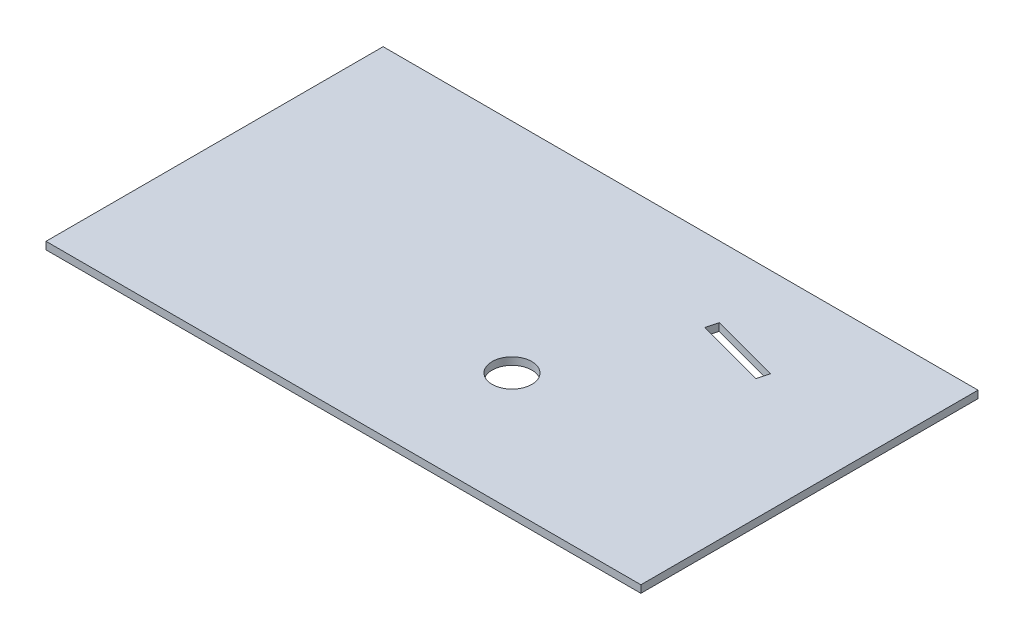
ISO-10303-21;
HEADER;
FILE_DESCRIPTION(('STEP AP214'),'2;1');
FILE_NAME('part.step','',(''),(''),'','','');
FILE_SCHEMA(('AUTOMOTIVE_DESIGN { 1 0 10303 214 1 1 1 1 }'));
ENDSEC;
DATA;
#1=APPLICATION_CONTEXT('core data for automotive mechanical design processes');
#2=APPLICATION_PROTOCOL_DEFINITION('international standard','automotive_design',2000,#1);
#3=PRODUCT_CONTEXT('',#1,'mechanical');
#4=PRODUCT('Part','Part','',(#3));
#5=PRODUCT_RELATED_PRODUCT_CATEGORY('part','',(#4));
#6=PRODUCT_DEFINITION_FORMATION('','',#4);
#7=PRODUCT_DEFINITION_CONTEXT('part definition',#1,'design');
#8=PRODUCT_DEFINITION('design','',#6,#7);
#9=PRODUCT_DEFINITION_SHAPE('','',#8);
#10=(LENGTH_UNIT() NAMED_UNIT(*) SI_UNIT(.MILLI.,.METRE.));
#11=(NAMED_UNIT(*) PLANE_ANGLE_UNIT() SI_UNIT($,.RADIAN.));
#12=(NAMED_UNIT(*) SI_UNIT($,.STERADIAN.) SOLID_ANGLE_UNIT());
#13=UNCERTAINTY_MEASURE_WITH_UNIT(LENGTH_MEASURE(1.E-05),#10,'distance_accuracy_value','');
#14=(GEOMETRIC_REPRESENTATION_CONTEXT(3) GLOBAL_UNCERTAINTY_ASSIGNED_CONTEXT((#13)) GLOBAL_UNIT_ASSIGNED_CONTEXT((#10,
#11,#12)) REPRESENTATION_CONTEXT('',''));
#15=CARTESIAN_POINT('',(0.,0.,0.));
#16=DIRECTION('',(0.,0.,1.));
#17=DIRECTION('',(1.,0.,0.));
#18=AXIS2_PLACEMENT_3D('',#15,#16,#17);
#19=CARTESIAN_POINT('',(0.,50.8,0.));
#20=DIRECTION('',(0.,1.,0.));
#21=DIRECTION('',(0.,0.,1.));
#22=AXIS2_PLACEMENT_3D('',#19,#20,#21);
#23=PLANE('',#22);
#24=DIRECTION('',(0.965925826289068,0.,0.258819045102521));
#25=VECTOR('',#24,1.);
#26=CARTESIAN_POINT('',(154.068293489598,50.8,-376.859298132638));
#27=LINE('',#26,#25);
#28=CARTESIAN_POINT('',(154.068293489598,50.8,-376.859298132638));
#29=VERTEX_POINT('',#28);
#30=CARTESIAN_POINT('',(332.764571353076,50.8,-328.977774788672));
#31=VERTEX_POINT('',#30);
#32=EDGE_CURVE('E181',#29,#31,#27,.T.);
#33=ORIENTED_EDGE('',*,*,#32,.F.);
#34=DIRECTION('',(0.258819045102523,0.,-0.965925826289067));
#35=VECTOR('',#34,1.);
#36=CARTESIAN_POINT('',(146.303722136522,50.8,-347.881523343966));
#37=LINE('',#36,#35);
#38=CARTESIAN_POINT('',(146.303722136522,50.8,-347.881523343966));
#39=VERTEX_POINT('',#38);
#40=EDGE_CURVE('E61',#39,#29,#37,.T.);
#41=ORIENTED_EDGE('',*,*,#40,.F.);
#42=DIRECTION('',(-0.965925826289068,0.,-0.258819045102522));
#43=VECTOR('',#42,1.);
#44=CARTESIAN_POINT('',(325.,50.8,-300.));
#45=LINE('',#44,#43);
#46=CARTESIAN_POINT('',(325.,50.8,-300.));
#47=VERTEX_POINT('',#46);
#48=EDGE_CURVE('E168',#47,#39,#45,.T.);
#49=ORIENTED_EDGE('',*,*,#48,.F.);
#50=DIRECTION('',(-0.258819045102525,0.,0.965925826289067));
#51=VECTOR('',#50,1.);
#52=CARTESIAN_POINT('',(332.764571353076,50.8,-328.977774788672));
#53=LINE('',#52,#51);
#54=EDGE_CURVE('E172',#31,#47,#53,.T.);
#55=ORIENTED_EDGE('',*,*,#54,.F.);
#56=EDGE_LOOP('',(#33,#41,#49,#55));
#57=FACE_BOUND('',#56,.T.);
#58=DIRECTION('',(0.,0.,1.));
#59=VECTOR('',#58,1.);
#60=CARTESIAN_POINT('',(-889.,50.8,-558.8));
#61=LINE('',#60,#59);
#62=CARTESIAN_POINT('',(-889.,50.8,-558.8));
#63=VERTEX_POINT('',#62);
#64=CARTESIAN_POINT('',(-889.,50.8,304.8));
#65=VERTEX_POINT('',#64);
#66=EDGE_CURVE('E230',#63,#65,#61,.T.);
#67=ORIENTED_EDGE('',*,*,#66,.F.);
#68=DIRECTION('',(-1.,0.,0.));
#69=VECTOR('',#68,1.);
#70=CARTESIAN_POINT('',(-889.,50.8,-558.8));
#71=LINE('',#70,#69);
#72=CARTESIAN_POINT('',(635.,50.8,-558.8));
#73=VERTEX_POINT('',#72);
#74=EDGE_CURVE('E236',#73,#63,#71,.T.);
#75=ORIENTED_EDGE('',*,*,#74,.F.);
#76=DIRECTION('',(0.,0.,-1.));
#77=VECTOR('',#76,1.);
#78=CARTESIAN_POINT('',(635.,50.8,-558.8));
#79=LINE('',#78,#77);
#80=CARTESIAN_POINT('',(635.,50.8,304.8));
#81=VERTEX_POINT('',#80);
#82=EDGE_CURVE('E252',#81,#73,#79,.T.);
#83=ORIENTED_EDGE('',*,*,#82,.F.);
#84=DIRECTION('',(1.,0.,0.));
#85=VECTOR('',#84,1.);
#86=CARTESIAN_POINT('',(-889.,50.8,304.8));
#87=LINE('',#86,#85);
#88=EDGE_CURVE('E249',#65,#81,#87,.T.);
#89=ORIENTED_EDGE('',*,*,#88,.F.);
#90=EDGE_LOOP('',(#67,#75,#83,#89));
#91=FACE_BOUND('',#90,.T.);
#92=CARTESIAN_POINT('',(0.,50.8,0.));
#93=DIRECTION('',(0.,-1.,0.));
#94=DIRECTION('',(0.,0.,-1.));
#95=AXIS2_PLACEMENT_3D('',#92,#93,#94);
#96=CIRCLE('',#95,50.8);
#97=CARTESIAN_POINT('',(0.,50.8,-50.8));
#98=VERTEX_POINT('',#97);
#99=EDGE_CURVE('E222',#98,#98,#96,.T.);
#100=ORIENTED_EDGE('',*,*,#99,.F.);
#101=EDGE_LOOP('',(#100));
#102=FACE_BOUND('',#101,.T.);
#103=DIRECTION('',(0.,0.,-1.));
#104=VECTOR('',#103,1.);
#105=CARTESIAN_POINT('',(-525.5875,50.8,204.));
#106=LINE('',#105,#104);
#107=CARTESIAN_POINT('',(-525.5875,50.8,204.));
#108=VERTEX_POINT('',#107);
#109=CARTESIAN_POINT('',(-525.5875,50.8,0.));
#110=VERTEX_POINT('',#109);
#111=EDGE_CURVE('E209',#108,#110,#106,.T.);
#112=ORIENTED_EDGE('',*,*,#111,.F.);
#113=DIRECTION('',(-1.,0.,0.));
#114=VECTOR('',#113,1.);
#115=CARTESIAN_POINT('',(-525.5875,50.8,204.));
#116=LINE('',#115,#114);
#117=CARTESIAN_POINT('',(-524.,50.8,204.));
#118=VERTEX_POINT('',#117);
#119=EDGE_CURVE('E206',#118,#108,#116,.T.);
#120=ORIENTED_EDGE('',*,*,#119,.F.);
#121=DIRECTION('',(0.,0.,-1.));
#122=VECTOR('',#121,1.);
#123=CARTESIAN_POINT('',(-524.,50.8,204.));
#124=LINE('',#123,#122);
#125=CARTESIAN_POINT('',(-524.,50.8,0.));
#126=VERTEX_POINT('',#125);
#127=EDGE_CURVE('E212',#118,#126,#124,.T.);
#128=ORIENTED_EDGE('',*,*,#127,.T.);
#129=CARTESIAN_POINT('',(0.,50.8,0.));
#130=DIRECTION('',(0.,-1.,0.));
#131=DIRECTION('',(0.,0.,1.));
#132=AXIS2_PLACEMENT_3D('',#129,#130,#131);
#133=CIRCLE('',#132,524.);
#134=CARTESIAN_POINT('',(277.677694458201,50.8,-444.377202385966));
#135=VERTEX_POINT('',#134);
#136=EDGE_CURVE('E273',#126,#135,#133,.T.);
#137=ORIENTED_EDGE('',*,*,#136,.T.);
#138=DIRECTION('',(0.,0.,-1.));
#139=VECTOR('',#138,1.);
#140=CARTESIAN_POINT('',(277.677694458201,50.8,-444.377202385966));
#141=LINE('',#140,#139);
#142=CARTESIAN_POINT('',(277.677694458201,50.8,-446.248045549365));
#143=VERTEX_POINT('',#142);
#144=EDGE_CURVE('E277',#135,#143,#141,.T.);
#145=ORIENTED_EDGE('',*,*,#144,.T.);
#146=CARTESIAN_POINT('',(0.,50.8,0.));
#147=DIRECTION('',(0.,1.,0.));
#148=DIRECTION('',(0.,0.,1.));
#149=AXIS2_PLACEMENT_3D('',#146,#147,#148);
#150=CIRCLE('',#149,525.5875);
#151=EDGE_CURVE('E282',#143,#110,#150,.T.);
#152=ORIENTED_EDGE('',*,*,#151,.T.);
#153=EDGE_LOOP('',(#112,#120,#128,#137,#145,#152));
#154=FACE_BOUND('',#153,.T.);
#155=ADVANCED_FACE('F45',(#57,#91,#102,#154),#23,.F.);
#156=CARTESIAN_POINT('',(0.,50.8,0.));
#157=DIRECTION('',(0.,-1.,0.));
#158=DIRECTION('',(0.,0.,-1.));
#159=AXIS2_PLACEMENT_3D('',#156,#157,#158);
#160=CYLINDRICAL_SURFACE('',#159,524.);
#161=CARTESIAN_POINT('',(0.,0.,0.));
#162=DIRECTION('',(0.,-1.,0.));
#163=DIRECTION('',(0.,0.,1.));
#164=AXIS2_PLACEMENT_3D('',#161,#162,#163);
#165=CIRCLE('',#164,524.);
#166=CARTESIAN_POINT('',(-524.,0.,0.));
#167=VERTEX_POINT('',#166);
#168=CARTESIAN_POINT('',(277.677694458201,0.,-444.377202385966));
#169=VERTEX_POINT('',#168);
#170=EDGE_CURVE('E272',#167,#169,#165,.T.);
#171=ORIENTED_EDGE('',*,*,#170,.T.);
#172=DIRECTION('',(0.,-1.,0.));
#173=VECTOR('',#172,1.);
#174=CARTESIAN_POINT('',(277.677694458201,50.8,-444.377202385966));
#175=LINE('',#174,#173);
#176=EDGE_CURVE('E11',#135,#169,#175,.T.);
#177=ORIENTED_EDGE('',*,*,#176,.F.);
#178=ORIENTED_EDGE('',*,*,#136,.F.);
#179=DIRECTION('',(0.,-1.,0.));
#180=VECTOR('',#179,1.);
#181=CARTESIAN_POINT('',(-524.,50.8,0.));
#182=LINE('',#181,#180);
#183=EDGE_CURVE('E286',#126,#167,#182,.T.);
#184=ORIENTED_EDGE('',*,*,#183,.T.);
#185=EDGE_LOOP('',(#171,#177,#178,#184));
#186=FACE_BOUND('',#185,.T.);
#187=ADVANCED_FACE('F47',(#186),#160,.F.);
#188=CARTESIAN_POINT('',(277.677694458201,50.8,-444.377202385966));
#189=DIRECTION('',(-1.,0.,0.));
#190=DIRECTION('',(0.,0.,1.));
#191=AXIS2_PLACEMENT_3D('',#188,#189,#190);
#192=PLANE('',#191);
#193=DIRECTION('',(0.,0.,-1.));
#194=VECTOR('',#193,1.);
#195=CARTESIAN_POINT('',(277.677694458201,0.,-444.377202385966));
#196=LINE('',#195,#194);
#197=CARTESIAN_POINT('',(277.677694458201,0.,-446.248045549365));
#198=VERTEX_POINT('',#197);
#199=EDGE_CURVE('E290',#169,#198,#196,.T.);
#200=ORIENTED_EDGE('',*,*,#199,.T.);
#201=DIRECTION('',(0.,-1.,0.));
#202=VECTOR('',#201,1.);
#203=CARTESIAN_POINT('',(277.677694458201,50.8,-446.248045549365));
#204=LINE('',#203,#202);
#205=EDGE_CURVE('E54',#143,#198,#204,.T.);
#206=ORIENTED_EDGE('',*,*,#205,.F.);
#207=ORIENTED_EDGE('',*,*,#144,.F.);
#208=ORIENTED_EDGE('',*,*,#176,.T.);
#209=EDGE_LOOP('',(#200,#206,#207,#208));
#210=FACE_BOUND('',#209,.T.);
#211=ADVANCED_FACE('F323',(#210),#192,.F.);
#212=CARTESIAN_POINT('',(0.,50.8,0.));
#213=DIRECTION('',(0.,-1.,0.));
#214=DIRECTION('',(0.,0.,-1.));
#215=AXIS2_PLACEMENT_3D('',#212,#213,#214);
#216=CYLINDRICAL_SURFACE('',#215,525.5875);
#217=CARTESIAN_POINT('',(0.,0.,0.));
#218=DIRECTION('',(0.,1.,0.));
#219=DIRECTION('',(0.,0.,1.));
#220=AXIS2_PLACEMENT_3D('',#217,#218,#219);
#221=CIRCLE('',#220,525.5875);
#222=CARTESIAN_POINT('',(-525.5875,0.,0.));
#223=VERTEX_POINT('',#222);
#224=EDGE_CURVE('E278',#198,#223,#221,.T.);
#225=ORIENTED_EDGE('',*,*,#224,.T.);
#226=DIRECTION('',(0.,-1.,0.));
#227=VECTOR('',#226,1.);
#228=CARTESIAN_POINT('',(-525.5875,50.8,0.));
#229=LINE('',#228,#227);
#230=EDGE_CURVE('E299',#110,#223,#229,.T.);
#231=ORIENTED_EDGE('',*,*,#230,.F.);
#232=ORIENTED_EDGE('',*,*,#151,.F.);
#233=ORIENTED_EDGE('',*,*,#205,.T.);
#234=EDGE_LOOP('',(#225,#231,#232,#233));
#235=FACE_BOUND('',#234,.T.);
#236=ADVANCED_FACE('F307',(#235),#216,.T.);
#237=CARTESIAN_POINT('',(0.,0.,0.));
#238=DIRECTION('',(0.,1.,0.));
#239=DIRECTION('',(0.,0.,1.));
#240=AXIS2_PLACEMENT_3D('',#237,#238,#239);
#241=PLANE('',#240);
#242=ORIENTED_EDGE('',*,*,#170,.F.);
#243=DIRECTION('',(0.,0.,-1.));
#244=VECTOR('',#243,1.);
#245=CARTESIAN_POINT('',(-524.,0.,204.));
#246=LINE('',#245,#244);
#247=CARTESIAN_POINT('',(-524.,0.,204.));
#248=VERTEX_POINT('',#247);
#249=EDGE_CURVE('E216',#248,#167,#246,.T.);
#250=ORIENTED_EDGE('',*,*,#249,.F.);
#251=DIRECTION('',(1.,0.,0.));
#252=VECTOR('',#251,1.);
#253=CARTESIAN_POINT('',(-525.5875,0.,204.));
#254=LINE('',#253,#252);
#255=CARTESIAN_POINT('',(-525.5875,0.,204.));
#256=VERTEX_POINT('',#255);
#257=EDGE_CURVE('E199',#256,#248,#254,.T.);
#258=ORIENTED_EDGE('',*,*,#257,.F.);
#259=DIRECTION('',(0.,0.,-1.));
#260=VECTOR('',#259,1.);
#261=CARTESIAN_POINT('',(-525.5875,0.,204.));
#262=LINE('',#261,#260);
#263=EDGE_CURVE('E219',#256,#223,#262,.T.);
#264=ORIENTED_EDGE('',*,*,#263,.T.);
#265=ORIENTED_EDGE('',*,*,#224,.F.);
#266=ORIENTED_EDGE('',*,*,#199,.F.);
#267=EDGE_LOOP('',(#242,#250,#258,#264,#265,#266));
#268=FACE_BOUND('',#267,.T.);
#269=ADVANCED_FACE('F312',(#268),#241,.F.);
#270=CARTESIAN_POINT('',(-889.,69.85,-558.8));
#271=DIRECTION('',(1.,0.,0.));
#272=DIRECTION('',(0.,0.,-1.));
#273=AXIS2_PLACEMENT_3D('',#270,#271,#272);
#274=PLANE('',#273);
#275=ORIENTED_EDGE('',*,*,#66,.T.);
#276=DIRECTION('',(0.,-1.,0.));
#277=VECTOR('',#276,1.);
#278=CARTESIAN_POINT('',(-889.,69.85,304.8));
#279=LINE('',#278,#277);
#280=CARTESIAN_POINT('',(-889.,69.85,304.8));
#281=VERTEX_POINT('',#280);
#282=EDGE_CURVE('E268',#281,#65,#279,.T.);
#283=ORIENTED_EDGE('',*,*,#282,.F.);
#284=DIRECTION('',(0.,0.,1.));
#285=VECTOR('',#284,1.);
#286=CARTESIAN_POINT('',(-889.,69.85,-558.8));
#287=LINE('',#286,#285);
#288=CARTESIAN_POINT('',(-889.,69.85,-558.8));
#289=VERTEX_POINT('',#288);
#290=EDGE_CURVE('E231',#289,#281,#287,.T.);
#291=ORIENTED_EDGE('',*,*,#290,.F.);
#292=DIRECTION('',(0.,-1.,0.));
#293=VECTOR('',#292,1.);
#294=CARTESIAN_POINT('',(-889.,69.85,-558.8));
#295=LINE('',#294,#293);
#296=EDGE_CURVE('E245',#289,#63,#295,.T.);
#297=ORIENTED_EDGE('',*,*,#296,.T.);
#298=EDGE_LOOP('',(#275,#283,#291,#297));
#299=FACE_BOUND('',#298,.T.);
#300=ADVANCED_FACE('F361',(#299),#274,.F.);
#301=CARTESIAN_POINT('',(-889.,69.85,304.8));
#302=DIRECTION('',(0.,0.,-1.));
#303=DIRECTION('',(-1.,0.,0.));
#304=AXIS2_PLACEMENT_3D('',#301,#302,#303);
#305=PLANE('',#304);
#306=ORIENTED_EDGE('',*,*,#88,.T.);
#307=DIRECTION('',(0.,-1.,0.));
#308=VECTOR('',#307,1.);
#309=CARTESIAN_POINT('',(635.,69.85,304.8));
#310=LINE('',#309,#308);
#311=CARTESIAN_POINT('',(635.,69.85,304.8));
#312=VERTEX_POINT('',#311);
#313=EDGE_CURVE('E264',#312,#81,#310,.T.);
#314=ORIENTED_EDGE('',*,*,#313,.F.);
#315=DIRECTION('',(1.,0.,0.));
#316=VECTOR('',#315,1.);
#317=CARTESIAN_POINT('',(-889.,69.85,304.8));
#318=LINE('',#317,#316);
#319=EDGE_CURVE('E235',#281,#312,#318,.T.);
#320=ORIENTED_EDGE('',*,*,#319,.F.);
#321=ORIENTED_EDGE('',*,*,#282,.T.);
#322=EDGE_LOOP('',(#306,#314,#320,#321));
#323=FACE_BOUND('',#322,.T.);
#324=ADVANCED_FACE('F357',(#323),#305,.F.);
#325=CARTESIAN_POINT('',(635.,69.85,-558.8));
#326=DIRECTION('',(-1.,0.,0.));
#327=DIRECTION('',(0.,0.,1.));
#328=AXIS2_PLACEMENT_3D('',#325,#326,#327);
#329=PLANE('',#328);
#330=ORIENTED_EDGE('',*,*,#82,.T.);
#331=DIRECTION('',(0.,-1.,0.));
#332=VECTOR('',#331,1.);
#333=CARTESIAN_POINT('',(635.,69.85,-558.8));
#334=LINE('',#333,#332);
#335=CARTESIAN_POINT('',(635.,69.85,-558.8));
#336=VERTEX_POINT('',#335);
#337=EDGE_CURVE('E260',#336,#73,#334,.T.);
#338=ORIENTED_EDGE('',*,*,#337,.F.);
#339=DIRECTION('',(0.,0.,-1.));
#340=VECTOR('',#339,1.);
#341=CARTESIAN_POINT('',(635.,69.85,-558.8));
#342=LINE('',#341,#340);
#343=EDGE_CURVE('E239',#312,#336,#342,.T.);
#344=ORIENTED_EDGE('',*,*,#343,.F.);
#345=ORIENTED_EDGE('',*,*,#313,.T.);
#346=EDGE_LOOP('',(#330,#338,#344,#345));
#347=FACE_BOUND('',#346,.T.);
#348=ADVANCED_FACE('F353',(#347),#329,.F.);
#349=CARTESIAN_POINT('',(-889.,69.85,-558.8));
#350=DIRECTION('',(0.,0.,1.));
#351=DIRECTION('',(1.,0.,0.));
#352=AXIS2_PLACEMENT_3D('',#349,#350,#351);
#353=PLANE('',#352);
#354=ORIENTED_EDGE('',*,*,#74,.T.);
#355=ORIENTED_EDGE('',*,*,#296,.F.);
#356=DIRECTION('',(-1.,0.,0.));
#357=VECTOR('',#356,1.);
#358=CARTESIAN_POINT('',(-889.,69.85,-558.8));
#359=LINE('',#358,#357);
#360=EDGE_CURVE('E242',#336,#289,#359,.T.);
#361=ORIENTED_EDGE('',*,*,#360,.F.);
#362=ORIENTED_EDGE('',*,*,#337,.T.);
#363=EDGE_LOOP('',(#354,#355,#361,#362));
#364=FACE_BOUND('',#363,.T.);
#365=ADVANCED_FACE('F350',(#364),#353,.F.);
#366=CARTESIAN_POINT('',(0.,69.85,0.));
#367=DIRECTION('',(0.,1.,0.));
#368=DIRECTION('',(0.,0.,1.));
#369=AXIS2_PLACEMENT_3D('',#366,#367,#368);
#370=PLANE('',#369);
#371=DIRECTION('',(0.258819045102523,0.,-0.965925826289067));
#372=VECTOR('',#371,1.);
#373=CARTESIAN_POINT('',(146.303722136522,69.85,-347.881523343966));
#374=LINE('',#373,#372);
#375=CARTESIAN_POINT('',(146.303722136522,69.85,-347.881523343966));
#376=VERTEX_POINT('',#375);
#377=CARTESIAN_POINT('',(154.068293489598,69.85,-376.859298132638));
#378=VERTEX_POINT('',#377);
#379=EDGE_CURVE('E149',#376,#378,#374,.T.);
#380=ORIENTED_EDGE('',*,*,#379,.T.);
#381=DIRECTION('',(0.965925826289068,0.,0.258819045102521));
#382=VECTOR('',#381,1.);
#383=CARTESIAN_POINT('',(154.068293489598,69.85,-376.859298132638));
#384=LINE('',#383,#382);
#385=CARTESIAN_POINT('',(332.764571353076,69.85,-328.977774788672));
#386=VERTEX_POINT('',#385);
#387=EDGE_CURVE('E159',#378,#386,#384,.T.);
#388=ORIENTED_EDGE('',*,*,#387,.T.);
#389=DIRECTION('',(-0.258819045102525,0.,0.965925826289067));
#390=VECTOR('',#389,1.);
#391=CARTESIAN_POINT('',(332.764571353076,69.85,-328.977774788672));
#392=LINE('',#391,#390);
#393=CARTESIAN_POINT('',(325.,69.85,-300.));
#394=VERTEX_POINT('',#393);
#395=EDGE_CURVE('E69',#386,#394,#392,.T.);
#396=ORIENTED_EDGE('',*,*,#395,.T.);
#397=DIRECTION('',(-0.965925826289068,0.,-0.258819045102522));
#398=VECTOR('',#397,1.);
#399=CARTESIAN_POINT('',(325.,69.85,-300.));
#400=LINE('',#399,#398);
#401=EDGE_CURVE('E156',#394,#376,#400,.T.);
#402=ORIENTED_EDGE('',*,*,#401,.T.);
#403=EDGE_LOOP('',(#380,#388,#396,#402));
#404=FACE_BOUND('',#403,.T.);
#405=CARTESIAN_POINT('',(0.,69.85,0.));
#406=DIRECTION('',(0.,-1.,0.));
#407=DIRECTION('',(0.,0.,-1.));
#408=AXIS2_PLACEMENT_3D('',#405,#406,#407);
#409=CIRCLE('',#408,50.8);
#410=CARTESIAN_POINT('',(0.,69.85,-50.8));
#411=VERTEX_POINT('',#410);
#412=EDGE_CURVE('E226',#411,#411,#409,.T.);
#413=ORIENTED_EDGE('',*,*,#412,.T.);
#414=EDGE_LOOP('',(#413));
#415=FACE_BOUND('',#414,.T.);
#416=ORIENTED_EDGE('',*,*,#290,.T.);
#417=ORIENTED_EDGE('',*,*,#319,.T.);
#418=ORIENTED_EDGE('',*,*,#343,.T.);
#419=ORIENTED_EDGE('',*,*,#360,.T.);
#420=EDGE_LOOP('',(#416,#417,#418,#419));
#421=FACE_BOUND('',#420,.T.);
#422=ADVANCED_FACE('F164',(#404,#415,#421),#370,.T.);
#423=CARTESIAN_POINT('',(0.,50.8,0.));
#424=DIRECTION('',(0.,-1.,0.));
#425=DIRECTION('',(0.,0.,-1.));
#426=AXIS2_PLACEMENT_3D('',#423,#424,#425);
#427=CYLINDRICAL_SURFACE('',#426,50.8);
#428=ORIENTED_EDGE('',*,*,#412,.F.);
#429=EDGE_LOOP('',(#428));
#430=FACE_BOUND('',#429,.T.);
#431=ORIENTED_EDGE('',*,*,#99,.T.);
#432=EDGE_LOOP('',(#431));
#433=FACE_BOUND('',#432,.T.);
#434=ADVANCED_FACE('F400',(#430,#433),#427,.F.);
#435=CARTESIAN_POINT('',(-525.5875,50.8,204.));
#436=DIRECTION('',(1.,0.,0.));
#437=DIRECTION('',(0.,0.,-1.));
#438=AXIS2_PLACEMENT_3D('',#435,#436,#437);
#439=PLANE('',#438);
#440=ORIENTED_EDGE('',*,*,#230,.T.);
#441=ORIENTED_EDGE('',*,*,#263,.F.);
#442=DIRECTION('',(0.,-1.,0.));
#443=VECTOR('',#442,1.);
#444=CARTESIAN_POINT('',(-525.5875,50.8,204.));
#445=LINE('',#444,#443);
#446=EDGE_CURVE('E190',#108,#256,#445,.T.);
#447=ORIENTED_EDGE('',*,*,#446,.F.);
#448=ORIENTED_EDGE('',*,*,#111,.T.);
#449=EDGE_LOOP('',(#440,#441,#447,#448));
#450=FACE_BOUND('',#449,.T.);
#451=ADVANCED_FACE('F317',(#450),#439,.F.);
#452=CARTESIAN_POINT('',(-524.,50.8,204.));
#453=DIRECTION('',(-1.,0.,0.));
#454=DIRECTION('',(0.,0.,1.));
#455=AXIS2_PLACEMENT_3D('',#452,#453,#454);
#456=PLANE('',#455);
#457=ORIENTED_EDGE('',*,*,#183,.F.);
#458=ORIENTED_EDGE('',*,*,#127,.F.);
#459=DIRECTION('',(0.,1.,0.));
#460=VECTOR('',#459,1.);
#461=CARTESIAN_POINT('',(-524.,50.8,204.));
#462=LINE('',#461,#460);
#463=EDGE_CURVE('E202',#248,#118,#462,.T.);
#464=ORIENTED_EDGE('',*,*,#463,.F.);
#465=ORIENTED_EDGE('',*,*,#249,.T.);
#466=EDGE_LOOP('',(#457,#458,#464,#465));
#467=FACE_BOUND('',#466,.T.);
#468=ADVANCED_FACE('F327',(#467),#456,.F.);
#469=CARTESIAN_POINT('',(0.,0.,204.));
#470=DIRECTION('',(0.,0.,1.));
#471=DIRECTION('',(1.,0.,0.));
#472=AXIS2_PLACEMENT_3D('',#469,#470,#471);
#473=PLANE('',#472);
#474=ORIENTED_EDGE('',*,*,#446,.T.);
#475=ORIENTED_EDGE('',*,*,#257,.T.);
#476=ORIENTED_EDGE('',*,*,#463,.T.);
#477=ORIENTED_EDGE('',*,*,#119,.T.);
#478=EDGE_LOOP('',(#474,#475,#476,#477));
#479=FACE_BOUND('',#478,.T.);
#480=ADVANCED_FACE('F329',(#479),#473,.T.);
#481=CARTESIAN_POINT('',(146.303722136522,69.85,-347.881523343966));
#482=DIRECTION('',(-0.965925826289068,0.,-0.258819045102523));
#483=DIRECTION('',(-0.258819045102524,0.,0.965925826289068));
#484=AXIS2_PLACEMENT_3D('',#481,#482,#483);
#485=PLANE('',#484);
#486=ORIENTED_EDGE('',*,*,#40,.T.);
#487=DIRECTION('',(0.,-1.,0.));
#488=VECTOR('',#487,1.);
#489=CARTESIAN_POINT('',(154.068293489598,69.85,-376.859298132638));
#490=LINE('',#489,#488);
#491=EDGE_CURVE('E145',#378,#29,#490,.T.);
#492=ORIENTED_EDGE('',*,*,#491,.F.);
#493=ORIENTED_EDGE('',*,*,#379,.F.);
#494=DIRECTION('',(0.,-1.,0.));
#495=VECTOR('',#494,1.);
#496=CARTESIAN_POINT('',(146.303722136522,69.85,-347.881523343966));
#497=LINE('',#496,#495);
#498=EDGE_CURVE('E187',#376,#39,#497,.T.);
#499=ORIENTED_EDGE('',*,*,#498,.T.);
#500=EDGE_LOOP('',(#486,#492,#493,#499));
#501=FACE_BOUND('',#500,.T.);
#502=ADVANCED_FACE('F147',(#501),#485,.F.);
#503=CARTESIAN_POINT('',(325.,69.85,-300.));
#504=DIRECTION('',(-0.258819045102522,0.,0.965925826289068));
#505=DIRECTION('',(0.965925826289068,0.,0.258819045102522));
#506=AXIS2_PLACEMENT_3D('',#503,#504,#505);
#507=PLANE('',#506);
#508=ORIENTED_EDGE('',*,*,#48,.T.);
#509=ORIENTED_EDGE('',*,*,#498,.F.);
#510=ORIENTED_EDGE('',*,*,#401,.F.);
#511=DIRECTION('',(0.,-1.,0.));
#512=VECTOR('',#511,1.);
#513=CARTESIAN_POINT('',(325.,69.85,-300.));
#514=LINE('',#513,#512);
#515=EDGE_CURVE('E191',#394,#47,#514,.T.);
#516=ORIENTED_EDGE('',*,*,#515,.T.);
#517=EDGE_LOOP('',(#508,#509,#510,#516));
#518=FACE_BOUND('',#517,.T.);
#519=ADVANCED_FACE('F337',(#518),#507,.F.);
#520=CARTESIAN_POINT('',(332.764571353076,69.85,-328.977774788672));
#521=DIRECTION('',(0.965925826289067,0.,0.258819045102525));
#522=DIRECTION('',(0.258819045102525,0.,-0.965925826289067));
#523=AXIS2_PLACEMENT_3D('',#520,#521,#522);
#524=PLANE('',#523);
#525=ORIENTED_EDGE('',*,*,#54,.T.);
#526=ORIENTED_EDGE('',*,*,#515,.F.);
#527=ORIENTED_EDGE('',*,*,#395,.F.);
#528=DIRECTION('',(0.,-1.,0.));
#529=VECTOR('',#528,1.);
#530=CARTESIAN_POINT('',(332.764571353076,69.85,-328.977774788672));
#531=LINE('',#530,#529);
#532=EDGE_CURVE('E155',#386,#31,#531,.T.);
#533=ORIENTED_EDGE('',*,*,#532,.T.);
#534=EDGE_LOOP('',(#525,#526,#527,#533));
#535=FACE_BOUND('',#534,.T.);
#536=ADVANCED_FACE('F449',(#535),#524,.F.);
#537=CARTESIAN_POINT('',(154.068293489598,69.85,-376.859298132638));
#538=DIRECTION('',(0.258819045102521,0.,-0.965925826289068));
#539=DIRECTION('',(-0.965925826289068,0.,-0.258819045102521));
#540=AXIS2_PLACEMENT_3D('',#537,#538,#539);
#541=PLANE('',#540);
#542=ORIENTED_EDGE('',*,*,#32,.T.);
#543=ORIENTED_EDGE('',*,*,#532,.F.);
#544=ORIENTED_EDGE('',*,*,#387,.F.);
#545=ORIENTED_EDGE('',*,*,#491,.T.);
#546=EDGE_LOOP('',(#542,#543,#544,#545));
#547=FACE_BOUND('',#546,.T.);
#548=ADVANCED_FACE('F160',(#547),#541,.F.);
#549=CLOSED_SHELL('',(#155,#187,#211,#236,#269,#300,#324,#348,#365,#422,#434,#451,#468,#480,
#502,#519,#536,#548));
#550=MANIFOLD_SOLID_BREP('B2',#549);
#551=ADVANCED_BREP_SHAPE_REPRESENTATION('',(#18,#550),#14);
#552=SHAPE_DEFINITION_REPRESENTATION(#9,#551);
ENDSEC;
END-ISO-10303-21;
